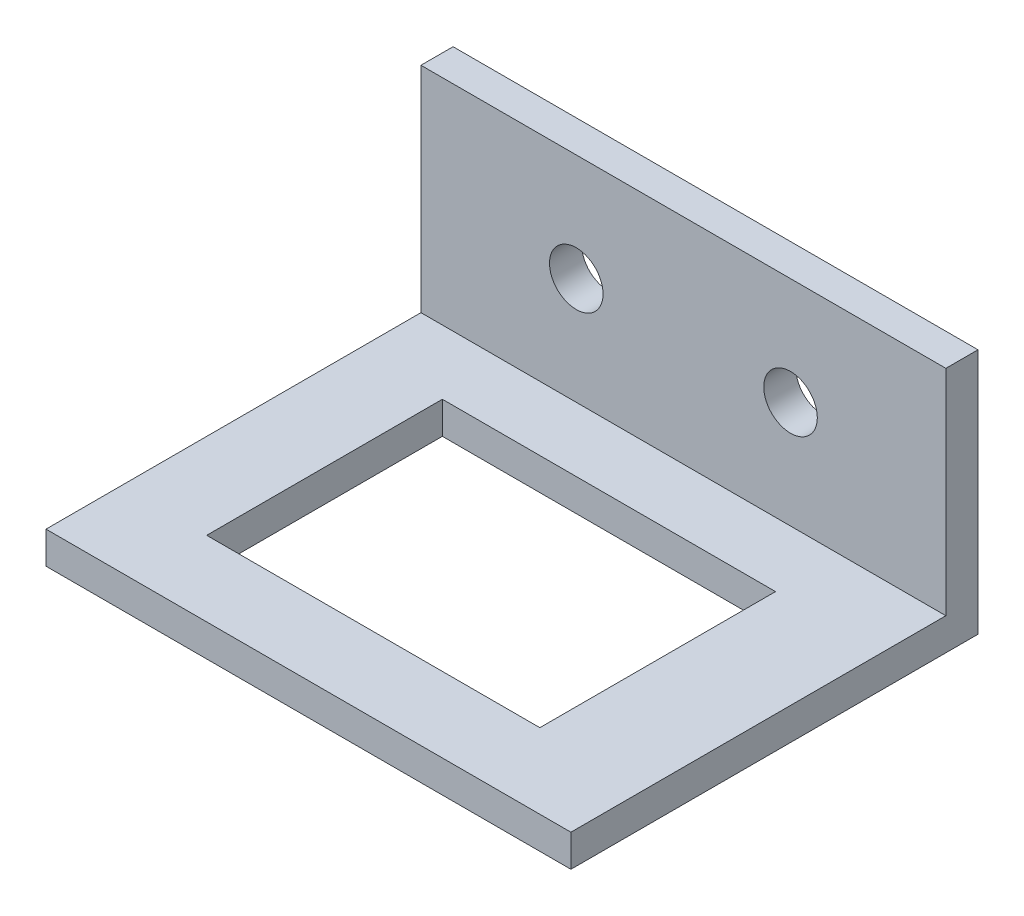
ISO-10303-21;
HEADER;
FILE_DESCRIPTION(('STEP AP214'),'2;1');
FILE_NAME('part.step','',(''),(''),'','','');
FILE_SCHEMA(('AUTOMOTIVE_DESIGN { 1 0 10303 214 1 1 1 1 }'));
ENDSEC;
DATA;
#1=APPLICATION_CONTEXT('core data for automotive mechanical design processes');
#2=APPLICATION_PROTOCOL_DEFINITION('international standard','automotive_design',2000,#1);
#3=PRODUCT_CONTEXT('',#1,'mechanical');
#4=PRODUCT('Part','Part','',(#3));
#5=PRODUCT_RELATED_PRODUCT_CATEGORY('part','',(#4));
#6=PRODUCT_DEFINITION_FORMATION('','',#4);
#7=PRODUCT_DEFINITION_CONTEXT('part definition',#1,'design');
#8=PRODUCT_DEFINITION('design','',#6,#7);
#9=PRODUCT_DEFINITION_SHAPE('','',#8);
#10=(LENGTH_UNIT() NAMED_UNIT(*) SI_UNIT(.MILLI.,.METRE.));
#11=(NAMED_UNIT(*) PLANE_ANGLE_UNIT() SI_UNIT($,.RADIAN.));
#12=(NAMED_UNIT(*) SI_UNIT($,.STERADIAN.) SOLID_ANGLE_UNIT());
#13=UNCERTAINTY_MEASURE_WITH_UNIT(LENGTH_MEASURE(1.E-05),#10,'distance_accuracy_value','');
#14=(GEOMETRIC_REPRESENTATION_CONTEXT(3) GLOBAL_UNCERTAINTY_ASSIGNED_CONTEXT((#13)) GLOBAL_UNIT_ASSIGNED_CONTEXT((#10,
#11,#12)) REPRESENTATION_CONTEXT('',''));
#15=CARTESIAN_POINT('',(0.,0.,0.));
#16=DIRECTION('',(0.,0.,1.));
#17=DIRECTION('',(1.,0.,0.));
#18=AXIS2_PLACEMENT_3D('',#15,#16,#17);
#19=CARTESIAN_POINT('',(49.,3.00000000000001,3.));
#20=DIRECTION('',(0.,-1.,0.));
#21=DIRECTION('',(0.,0.,-1.));
#22=AXIS2_PLACEMENT_3D('',#19,#20,#21);
#23=PLANE('',#22);
#24=DIRECTION('',(1.,0.,0.));
#25=VECTOR('',#24,1.);
#26=CARTESIAN_POINT('',(8.,3.,31.));
#27=LINE('',#26,#25);
#28=CARTESIAN_POINT('',(8.00000000000001,3.,31.));
#29=VERTEX_POINT('',#28);
#30=CARTESIAN_POINT('',(39.1,3.,31.));
#31=VERTEX_POINT('',#30);
#32=EDGE_CURVE('E125',#29,#31,#27,.T.);
#33=ORIENTED_EDGE('',*,*,#32,.F.);
#34=DIRECTION('',(0.,0.,1.));
#35=VECTOR('',#34,1.);
#36=CARTESIAN_POINT('',(8.,3.00000000000001,9.));
#37=LINE('',#36,#35);
#38=CARTESIAN_POINT('',(8.,3.00000000000001,9.));
#39=VERTEX_POINT('',#38);
#40=EDGE_CURVE('E51',#39,#29,#37,.T.);
#41=ORIENTED_EDGE('',*,*,#40,.F.);
#42=DIRECTION('',(-1.,0.,0.));
#43=VECTOR('',#42,1.);
#44=CARTESIAN_POINT('',(8.,3.00000000000001,9.));
#45=LINE('',#44,#43);
#46=CARTESIAN_POINT('',(39.1,3.00000000000001,9.));
#47=VERTEX_POINT('',#46);
#48=EDGE_CURVE('E131',#47,#39,#45,.T.);
#49=ORIENTED_EDGE('',*,*,#48,.F.);
#50=DIRECTION('',(0.,0.,-1.));
#51=VECTOR('',#50,1.);
#52=CARTESIAN_POINT('',(39.1,3.00000000000001,9.));
#53=LINE('',#52,#51);
#54=EDGE_CURVE('E116',#31,#47,#53,.T.);
#55=ORIENTED_EDGE('',*,*,#54,.F.);
#56=EDGE_LOOP('',(#33,#41,#49,#55));
#57=FACE_BOUND('',#56,.T.);
#58=DIRECTION('',(0.,0.,1.));
#59=VECTOR('',#58,1.);
#60=CARTESIAN_POINT('',(0.,3.00000000000001,3.));
#61=LINE('',#60,#59);
#62=CARTESIAN_POINT('',(0.,3.00000000000001,3.));
#63=VERTEX_POINT('',#62);
#64=CARTESIAN_POINT('',(0.,3.,38.));
#65=VERTEX_POINT('',#64);
#66=EDGE_CURVE('E142',#63,#65,#61,.T.);
#67=ORIENTED_EDGE('',*,*,#66,.T.);
#68=DIRECTION('',(-1.,0.,0.));
#69=VECTOR('',#68,1.);
#70=CARTESIAN_POINT('',(49.,3.,38.));
#71=LINE('',#70,#69);
#72=CARTESIAN_POINT('',(49.,3.,38.));
#73=VERTEX_POINT('',#72);
#74=EDGE_CURVE('E11',#73,#65,#71,.T.);
#75=ORIENTED_EDGE('',*,*,#74,.F.);
#76=DIRECTION('',(0.,0.,1.));
#77=VECTOR('',#76,1.);
#78=CARTESIAN_POINT('',(49.,3.00000000000001,3.));
#79=LINE('',#78,#77);
#80=CARTESIAN_POINT('',(49.,3.00000000000001,3.));
#81=VERTEX_POINT('',#80);
#82=EDGE_CURVE('E144',#81,#73,#79,.T.);
#83=ORIENTED_EDGE('',*,*,#82,.F.);
#84=DIRECTION('',(-1.,0.,0.));
#85=VECTOR('',#84,1.);
#86=CARTESIAN_POINT('',(49.,3.00000000000001,3.));
#87=LINE('',#86,#85);
#88=EDGE_CURVE('E158',#81,#63,#87,.T.);
#89=ORIENTED_EDGE('',*,*,#88,.T.);
#90=EDGE_LOOP('',(#67,#75,#83,#89));
#91=FACE_BOUND('',#90,.T.);
#92=ADVANCED_FACE('F37',(#57,#91),#23,.F.);
#93=CARTESIAN_POINT('',(49.,3.,38.));
#94=DIRECTION('',(0.,0.,-1.));
#95=DIRECTION('',(-1.,0.,0.));
#96=AXIS2_PLACEMENT_3D('',#93,#94,#95);
#97=PLANE('',#96);
#98=DIRECTION('',(0.,-1.,0.));
#99=VECTOR('',#98,1.);
#100=CARTESIAN_POINT('',(0.,3.,38.));
#101=LINE('',#100,#99);
#102=CARTESIAN_POINT('',(0.,0.,38.));
#103=VERTEX_POINT('',#102);
#104=EDGE_CURVE('E161',#65,#103,#101,.T.);
#105=ORIENTED_EDGE('',*,*,#104,.T.);
#106=DIRECTION('',(-1.,0.,0.));
#107=VECTOR('',#106,1.);
#108=CARTESIAN_POINT('',(49.,0.,38.));
#109=LINE('',#108,#107);
#110=CARTESIAN_POINT('',(49.,0.,38.));
#111=VERTEX_POINT('',#110);
#112=EDGE_CURVE('E44',#111,#103,#109,.T.);
#113=ORIENTED_EDGE('',*,*,#112,.F.);
#114=DIRECTION('',(0.,-1.,0.));
#115=VECTOR('',#114,1.);
#116=CARTESIAN_POINT('',(49.,3.,38.));
#117=LINE('',#116,#115);
#118=EDGE_CURVE('E147',#73,#111,#117,.T.);
#119=ORIENTED_EDGE('',*,*,#118,.F.);
#120=ORIENTED_EDGE('',*,*,#74,.T.);
#121=EDGE_LOOP('',(#105,#113,#119,#120));
#122=FACE_BOUND('',#121,.T.);
#123=ADVANCED_FACE('F208',(#122),#97,.F.);
#124=CARTESIAN_POINT('',(49.,0.,38.));
#125=DIRECTION('',(0.,1.,0.));
#126=DIRECTION('',(0.,0.,1.));
#127=AXIS2_PLACEMENT_3D('',#124,#125,#126);
#128=PLANE('',#127);
#129=DIRECTION('',(1.,0.,0.));
#130=VECTOR('',#129,1.);
#131=CARTESIAN_POINT('',(8.,0.,9.));
#132=LINE('',#131,#130);
#133=CARTESIAN_POINT('',(8.,0.,9.));
#134=VERTEX_POINT('',#133);
#135=CARTESIAN_POINT('',(39.1,0.,8.99999999999998));
#136=VERTEX_POINT('',#135);
#137=EDGE_CURVE('E256',#134,#136,#132,.T.);
#138=ORIENTED_EDGE('',*,*,#137,.F.);
#139=DIRECTION('',(0.,0.,-1.));
#140=VECTOR('',#139,1.);
#141=CARTESIAN_POINT('',(8.,0.,8.99999999999998));
#142=LINE('',#141,#140);
#143=CARTESIAN_POINT('',(8.,0.,31.));
#144=VERTEX_POINT('',#143);
#145=EDGE_CURVE('E143',#144,#134,#142,.T.);
#146=ORIENTED_EDGE('',*,*,#145,.F.);
#147=DIRECTION('',(-1.,0.,0.));
#148=VECTOR('',#147,1.);
#149=CARTESIAN_POINT('',(8.,0.,31.));
#150=LINE('',#149,#148);
#151=CARTESIAN_POINT('',(39.1,0.,31.));
#152=VERTEX_POINT('',#151);
#153=EDGE_CURVE('E140',#152,#144,#150,.T.);
#154=ORIENTED_EDGE('',*,*,#153,.F.);
#155=DIRECTION('',(0.,0.,1.));
#156=VECTOR('',#155,1.);
#157=CARTESIAN_POINT('',(39.1,0.,8.99999999999998));
#158=LINE('',#157,#156);
#159=EDGE_CURVE('E119',#136,#152,#158,.T.);
#160=ORIENTED_EDGE('',*,*,#159,.F.);
#161=EDGE_LOOP('',(#138,#146,#154,#160));
#162=FACE_BOUND('',#161,.T.);
#163=DIRECTION('',(0.,0.,-1.));
#164=VECTOR('',#163,1.);
#165=CARTESIAN_POINT('',(0.,0.,38.));
#166=LINE('',#165,#164);
#167=CARTESIAN_POINT('',(0.,0.,0.));
#168=VERTEX_POINT('',#167);
#169=EDGE_CURVE('E163',#103,#168,#166,.T.);
#170=ORIENTED_EDGE('',*,*,#169,.T.);
#171=DIRECTION('',(-1.,0.,0.));
#172=VECTOR('',#171,1.);
#173=CARTESIAN_POINT('',(49.,0.,0.));
#174=LINE('',#173,#172);
#175=CARTESIAN_POINT('',(49.,0.,0.));
#176=VERTEX_POINT('',#175);
#177=EDGE_CURVE('E178',#176,#168,#174,.T.);
#178=ORIENTED_EDGE('',*,*,#177,.F.);
#179=DIRECTION('',(0.,0.,-1.));
#180=VECTOR('',#179,1.);
#181=CARTESIAN_POINT('',(49.,0.,38.));
#182=LINE('',#181,#180);
#183=EDGE_CURVE('E150',#111,#176,#182,.T.);
#184=ORIENTED_EDGE('',*,*,#183,.F.);
#185=ORIENTED_EDGE('',*,*,#112,.T.);
#186=EDGE_LOOP('',(#170,#178,#184,#185));
#187=FACE_BOUND('',#186,.T.);
#188=ADVANCED_FACE('F185',(#162,#187),#128,.F.);
#189=CARTESIAN_POINT('',(49.,0.,0.));
#190=DIRECTION('',(0.,0.,1.));
#191=DIRECTION('',(0.,-1.,0.));
#192=AXIS2_PLACEMENT_3D('',#189,#190,#191);
#193=PLANE('',#192);
#194=CARTESIAN_POINT('',(14.5,13.,0.));
#195=DIRECTION('',(0.,0.,1.));
#196=DIRECTION('',(0.,-1.,0.));
#197=AXIS2_PLACEMENT_3D('',#194,#195,#196);
#198=CIRCLE('',#197,2.5);
#199=CARTESIAN_POINT('',(14.5,10.5,0.));
#200=VERTEX_POINT('',#199);
#201=EDGE_CURVE('E242',#200,#200,#198,.F.);
#202=ORIENTED_EDGE('',*,*,#201,.F.);
#203=EDGE_LOOP('',(#202));
#204=FACE_BOUND('',#203,.T.);
#205=CARTESIAN_POINT('',(34.5,13.,0.));
#206=DIRECTION('',(0.,0.,1.));
#207=DIRECTION('',(0.,-1.,0.));
#208=AXIS2_PLACEMENT_3D('',#205,#206,#207);
#209=CIRCLE('',#208,2.5);
#210=CARTESIAN_POINT('',(34.5,10.5,0.));
#211=VERTEX_POINT('',#210);
#212=EDGE_CURVE('E245',#211,#211,#209,.F.);
#213=ORIENTED_EDGE('',*,*,#212,.F.);
#214=EDGE_LOOP('',(#213));
#215=FACE_BOUND('',#214,.T.);
#216=DIRECTION('',(0.,1.,0.));
#217=VECTOR('',#216,1.);
#218=CARTESIAN_POINT('',(0.,0.,0.));
#219=LINE('',#218,#217);
#220=CARTESIAN_POINT('',(0.,23.,0.));
#221=VERTEX_POINT('',#220);
#222=EDGE_CURVE('E165',#168,#221,#219,.T.);
#223=ORIENTED_EDGE('',*,*,#222,.T.);
#224=DIRECTION('',(-1.,0.,0.));
#225=VECTOR('',#224,1.);
#226=CARTESIAN_POINT('',(49.,23.,0.));
#227=LINE('',#226,#225);
#228=CARTESIAN_POINT('',(49.,23.,0.));
#229=VERTEX_POINT('',#228);
#230=EDGE_CURVE('E175',#229,#221,#227,.T.);
#231=ORIENTED_EDGE('',*,*,#230,.F.);
#232=DIRECTION('',(0.,1.,0.));
#233=VECTOR('',#232,1.);
#234=CARTESIAN_POINT('',(49.,0.,0.));
#235=LINE('',#234,#233);
#236=EDGE_CURVE('E152',#176,#229,#235,.T.);
#237=ORIENTED_EDGE('',*,*,#236,.F.);
#238=ORIENTED_EDGE('',*,*,#177,.T.);
#239=EDGE_LOOP('',(#223,#231,#237,#238));
#240=FACE_BOUND('',#239,.T.);
#241=ADVANCED_FACE('F196',(#204,#215,#240),#193,.F.);
#242=CARTESIAN_POINT('',(49.,23.,0.));
#243=DIRECTION('',(0.,-1.,0.));
#244=DIRECTION('',(0.,0.,-1.));
#245=AXIS2_PLACEMENT_3D('',#242,#243,#244);
#246=PLANE('',#245);
#247=DIRECTION('',(0.,0.,1.));
#248=VECTOR('',#247,1.);
#249=CARTESIAN_POINT('',(0.,23.,0.));
#250=LINE('',#249,#248);
#251=CARTESIAN_POINT('',(0.,23.,3.));
#252=VERTEX_POINT('',#251);
#253=EDGE_CURVE('E167',#221,#252,#250,.T.);
#254=ORIENTED_EDGE('',*,*,#253,.T.);
#255=DIRECTION('',(-1.,0.,0.));
#256=VECTOR('',#255,1.);
#257=CARTESIAN_POINT('',(49.,23.,3.));
#258=LINE('',#257,#256);
#259=CARTESIAN_POINT('',(49.,23.,3.));
#260=VERTEX_POINT('',#259);
#261=EDGE_CURVE('E172',#260,#252,#258,.T.);
#262=ORIENTED_EDGE('',*,*,#261,.F.);
#263=DIRECTION('',(0.,0.,1.));
#264=VECTOR('',#263,1.);
#265=CARTESIAN_POINT('',(49.,23.,0.));
#266=LINE('',#265,#264);
#267=EDGE_CURVE('E154',#229,#260,#266,.T.);
#268=ORIENTED_EDGE('',*,*,#267,.F.);
#269=ORIENTED_EDGE('',*,*,#230,.T.);
#270=EDGE_LOOP('',(#254,#262,#268,#269));
#271=FACE_BOUND('',#270,.T.);
#272=ADVANCED_FACE('F200',(#271),#246,.F.);
#273=CARTESIAN_POINT('',(49.,23.,3.));
#274=DIRECTION('',(0.,0.,-1.));
#275=DIRECTION('',(0.,1.,0.));
#276=AXIS2_PLACEMENT_3D('',#273,#274,#275);
#277=PLANE('',#276);
#278=CARTESIAN_POINT('',(14.5,13.,2.99999999999999));
#279=DIRECTION('',(0.,0.,1.));
#280=DIRECTION('',(1.,0.,0.));
#281=AXIS2_PLACEMENT_3D('',#278,#279,#280);
#282=CIRCLE('',#281,2.5);
#283=CARTESIAN_POINT('',(17.,13.,2.99999999999999));
#284=VERTEX_POINT('',#283);
#285=EDGE_CURVE('E250',#284,#284,#282,.T.);
#286=ORIENTED_EDGE('',*,*,#285,.F.);
#287=EDGE_LOOP('',(#286));
#288=FACE_BOUND('',#287,.T.);
#289=CARTESIAN_POINT('',(34.5,13.,2.99999999999999));
#290=DIRECTION('',(0.,0.,1.));
#291=DIRECTION('',(1.,0.,0.));
#292=AXIS2_PLACEMENT_3D('',#289,#290,#291);
#293=CIRCLE('',#292,2.5);
#294=CARTESIAN_POINT('',(37.,13.,2.99999999999999));
#295=VERTEX_POINT('',#294);
#296=EDGE_CURVE('E247',#295,#295,#293,.T.);
#297=ORIENTED_EDGE('',*,*,#296,.F.);
#298=EDGE_LOOP('',(#297));
#299=FACE_BOUND('',#298,.T.);
#300=DIRECTION('',(0.,-1.,0.));
#301=VECTOR('',#300,1.);
#302=CARTESIAN_POINT('',(0.,23.,3.));
#303=LINE('',#302,#301);
#304=EDGE_CURVE('E148',#252,#63,#303,.T.);
#305=ORIENTED_EDGE('',*,*,#304,.T.);
#306=ORIENTED_EDGE('',*,*,#88,.F.);
#307=DIRECTION('',(0.,-1.,0.));
#308=VECTOR('',#307,1.);
#309=CARTESIAN_POINT('',(49.,23.,3.));
#310=LINE('',#309,#308);
#311=EDGE_CURVE('E156',#260,#81,#310,.T.);
#312=ORIENTED_EDGE('',*,*,#311,.F.);
#313=ORIENTED_EDGE('',*,*,#261,.T.);
#314=EDGE_LOOP('',(#305,#306,#312,#313));
#315=FACE_BOUND('',#314,.T.);
#316=ADVANCED_FACE('F210',(#288,#299,#315),#277,.F.);
#317=CARTESIAN_POINT('',(49.,0.,0.));
#318=DIRECTION('',(1.,0.,0.));
#319=DIRECTION('',(0.,0.,-1.));
#320=AXIS2_PLACEMENT_3D('',#317,#318,#319);
#321=PLANE('',#320);
#322=ORIENTED_EDGE('',*,*,#82,.T.);
#323=ORIENTED_EDGE('',*,*,#118,.T.);
#324=ORIENTED_EDGE('',*,*,#183,.T.);
#325=ORIENTED_EDGE('',*,*,#236,.T.);
#326=ORIENTED_EDGE('',*,*,#267,.T.);
#327=ORIENTED_EDGE('',*,*,#311,.T.);
#328=EDGE_LOOP('',(#322,#323,#324,#325,#326,#327));
#329=FACE_BOUND('',#328,.T.);
#330=ADVANCED_FACE('F204',(#329),#321,.T.);
#331=CARTESIAN_POINT('',(0.,0.,0.));
#332=DIRECTION('',(1.,0.,0.));
#333=DIRECTION('',(0.,0.,-1.));
#334=AXIS2_PLACEMENT_3D('',#331,#332,#333);
#335=PLANE('',#334);
#336=ORIENTED_EDGE('',*,*,#66,.F.);
#337=ORIENTED_EDGE('',*,*,#304,.F.);
#338=ORIENTED_EDGE('',*,*,#253,.F.);
#339=ORIENTED_EDGE('',*,*,#222,.F.);
#340=ORIENTED_EDGE('',*,*,#169,.F.);
#341=ORIENTED_EDGE('',*,*,#104,.F.);
#342=EDGE_LOOP('',(#336,#337,#338,#339,#340,#341));
#343=FACE_BOUND('',#342,.T.);
#344=ADVANCED_FACE('F191',(#343),#335,.F.);
#345=CARTESIAN_POINT('',(8.,-38.094750294496,8.99999999999998));
#346=DIRECTION('',(-1.,0.,0.));
#347=DIRECTION('',(0.,0.,1.));
#348=AXIS2_PLACEMENT_3D('',#345,#346,#347);
#349=PLANE('',#348);
#350=ORIENTED_EDGE('',*,*,#145,.T.);
#351=DIRECTION('',(0.,1.,0.));
#352=VECTOR('',#351,1.);
#353=CARTESIAN_POINT('',(8.,-38.094750294496,8.99999999999998));
#354=LINE('',#353,#352);
#355=EDGE_CURVE('E136',#134,#39,#354,.T.);
#356=ORIENTED_EDGE('',*,*,#355,.T.);
#357=ORIENTED_EDGE('',*,*,#40,.T.);
#358=DIRECTION('',(0.,1.,0.));
#359=VECTOR('',#358,1.);
#360=CARTESIAN_POINT('',(8.,-38.094750294496,31.));
#361=LINE('',#360,#359);
#362=EDGE_CURVE('E122',#144,#29,#361,.T.);
#363=ORIENTED_EDGE('',*,*,#362,.F.);
#364=EDGE_LOOP('',(#350,#356,#357,#363));
#365=FACE_BOUND('',#364,.T.);
#366=ADVANCED_FACE('F273',(#365),#349,.F.);
#367=CARTESIAN_POINT('',(8.,-38.094750294496,8.99999999999998));
#368=DIRECTION('',(0.,0.,-1.));
#369=DIRECTION('',(0.,1.,0.));
#370=AXIS2_PLACEMENT_3D('',#367,#368,#369);
#371=PLANE('',#370);
#372=ORIENTED_EDGE('',*,*,#137,.T.);
#373=DIRECTION('',(0.,1.,0.));
#374=VECTOR('',#373,1.);
#375=CARTESIAN_POINT('',(39.1,-38.094750294496,8.99999999999998));
#376=LINE('',#375,#374);
#377=EDGE_CURVE('E121',#136,#47,#376,.T.);
#378=ORIENTED_EDGE('',*,*,#377,.T.);
#379=ORIENTED_EDGE('',*,*,#48,.T.);
#380=ORIENTED_EDGE('',*,*,#355,.F.);
#381=EDGE_LOOP('',(#372,#378,#379,#380));
#382=FACE_BOUND('',#381,.T.);
#383=ADVANCED_FACE('F270',(#382),#371,.F.);
#384=CARTESIAN_POINT('',(39.1,-38.094750294496,8.99999999999998));
#385=DIRECTION('',(1.,0.,0.));
#386=DIRECTION('',(0.,0.,-1.));
#387=AXIS2_PLACEMENT_3D('',#384,#385,#386);
#388=PLANE('',#387);
#389=ORIENTED_EDGE('',*,*,#159,.T.);
#390=DIRECTION('',(0.,1.,0.));
#391=VECTOR('',#390,1.);
#392=CARTESIAN_POINT('',(39.1,-38.094750294496,31.));
#393=LINE('',#392,#391);
#394=EDGE_CURVE('E59',#152,#31,#393,.T.);
#395=ORIENTED_EDGE('',*,*,#394,.T.);
#396=ORIENTED_EDGE('',*,*,#54,.T.);
#397=ORIENTED_EDGE('',*,*,#377,.F.);
#398=EDGE_LOOP('',(#389,#395,#396,#397));
#399=FACE_BOUND('',#398,.T.);
#400=ADVANCED_FACE('F113',(#399),#388,.F.);
#401=CARTESIAN_POINT('',(8.,-38.094750294496,31.));
#402=DIRECTION('',(0.,0.,1.));
#403=DIRECTION('',(0.,-1.,0.));
#404=AXIS2_PLACEMENT_3D('',#401,#402,#403);
#405=PLANE('',#404);
#406=ORIENTED_EDGE('',*,*,#153,.T.);
#407=ORIENTED_EDGE('',*,*,#362,.T.);
#408=ORIENTED_EDGE('',*,*,#32,.T.);
#409=ORIENTED_EDGE('',*,*,#394,.F.);
#410=EDGE_LOOP('',(#406,#407,#408,#409));
#411=FACE_BOUND('',#410,.T.);
#412=ADVANCED_FACE('F126',(#411),#405,.F.);
#413=CARTESIAN_POINT('',(34.5,13.,-7.07106781186548));
#414=DIRECTION('',(0.,0.,1.));
#415=DIRECTION('',(1.,0.,0.));
#416=AXIS2_PLACEMENT_3D('',#413,#414,#415);
#417=CYLINDRICAL_SURFACE('',#416,2.5);
#418=ORIENTED_EDGE('',*,*,#212,.T.);
#419=EDGE_LOOP('',(#418));
#420=FACE_BOUND('',#419,.T.);
#421=ORIENTED_EDGE('',*,*,#296,.T.);
#422=EDGE_LOOP('',(#421));
#423=FACE_BOUND('',#422,.T.);
#424=ADVANCED_FACE('F263',(#420,#423),#417,.F.);
#425=CARTESIAN_POINT('',(14.5,13.,-7.07106781186548));
#426=DIRECTION('',(0.,0.,1.));
#427=DIRECTION('',(1.,0.,0.));
#428=AXIS2_PLACEMENT_3D('',#425,#426,#427);
#429=CYLINDRICAL_SURFACE('',#428,2.5);
#430=ORIENTED_EDGE('',*,*,#201,.T.);
#431=EDGE_LOOP('',(#430));
#432=FACE_BOUND('',#431,.T.);
#433=ORIENTED_EDGE('',*,*,#285,.T.);
#434=EDGE_LOOP('',(#433));
#435=FACE_BOUND('',#434,.T.);
#436=ADVANCED_FACE('F261',(#432,#435),#429,.F.);
#437=CLOSED_SHELL('',(#92,#123,#188,#241,#272,#316,#330,#344,#366,#383,#400,#412,#424,#436));
#438=MANIFOLD_SOLID_BREP('B2',#437);
#439=ADVANCED_BREP_SHAPE_REPRESENTATION('',(#18,#438),#14);
#440=SHAPE_DEFINITION_REPRESENTATION(#9,#439);
ENDSEC;
END-ISO-10303-21;
